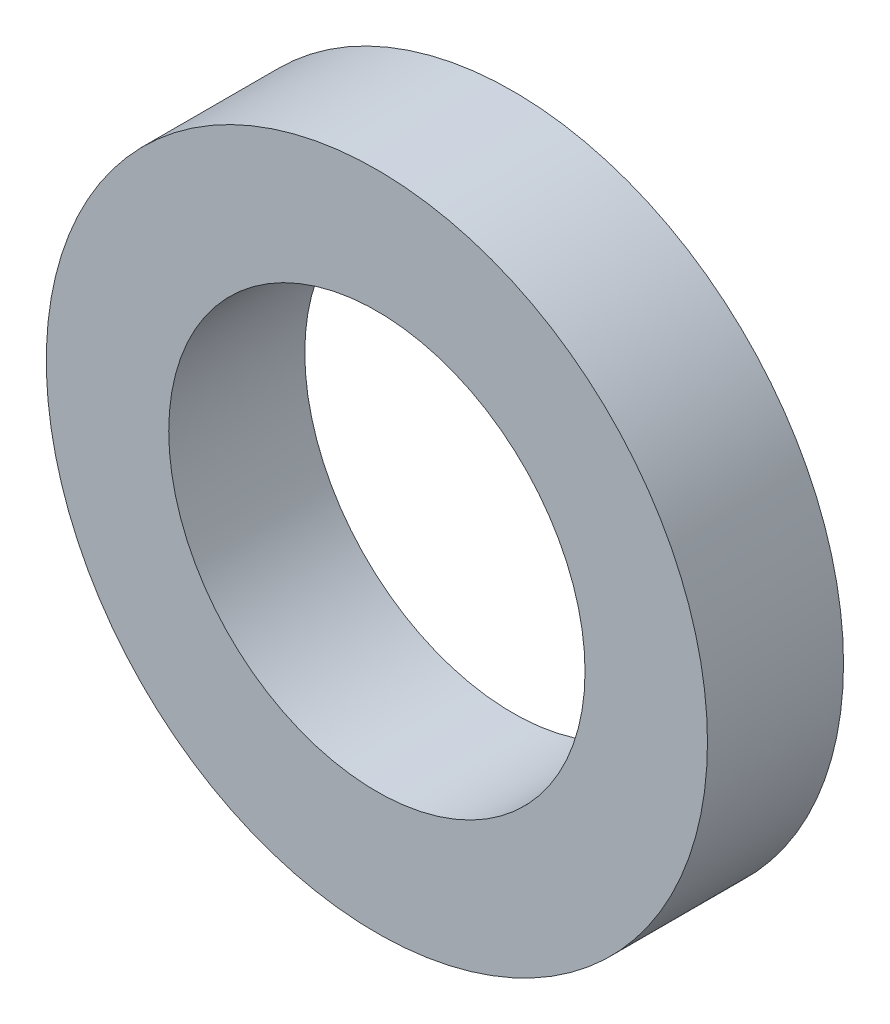
ISO-10303-21;
HEADER;
FILE_DESCRIPTION(('STEP AP214'),'2;1');
FILE_NAME('part.step','',(''),(''),'','','');
FILE_SCHEMA(('AUTOMOTIVE_DESIGN { 1 0 10303 214 1 1 1 1 }'));
ENDSEC;
DATA;
#1=APPLICATION_CONTEXT('core data for automotive mechanical design processes');
#2=APPLICATION_PROTOCOL_DEFINITION('international standard','automotive_design',2000,#1);
#3=PRODUCT_CONTEXT('',#1,'mechanical');
#4=PRODUCT('Part','Part','',(#3));
#5=PRODUCT_RELATED_PRODUCT_CATEGORY('part','',(#4));
#6=PRODUCT_DEFINITION_FORMATION('','',#4);
#7=PRODUCT_DEFINITION_CONTEXT('part definition',#1,'design');
#8=PRODUCT_DEFINITION('design','',#6,#7);
#9=PRODUCT_DEFINITION_SHAPE('','',#8);
#10=(LENGTH_UNIT() NAMED_UNIT(*) SI_UNIT(.MILLI.,.METRE.));
#11=(NAMED_UNIT(*) PLANE_ANGLE_UNIT() SI_UNIT($,.RADIAN.));
#12=(NAMED_UNIT(*) SI_UNIT($,.STERADIAN.) SOLID_ANGLE_UNIT());
#13=UNCERTAINTY_MEASURE_WITH_UNIT(LENGTH_MEASURE(1.E-05),#10,'distance_accuracy_value','');
#14=(GEOMETRIC_REPRESENTATION_CONTEXT(3) GLOBAL_UNCERTAINTY_ASSIGNED_CONTEXT((#13)) GLOBAL_UNIT_ASSIGNED_CONTEXT((#10,
#11,#12)) REPRESENTATION_CONTEXT('',''));
#15=CARTESIAN_POINT('',(0.,0.,0.));
#16=DIRECTION('',(0.,0.,1.));
#17=DIRECTION('',(1.,0.,0.));
#18=AXIS2_PLACEMENT_3D('',#15,#16,#17);
#19=CARTESIAN_POINT('',(0.,0.,5.));
#20=DIRECTION('',(0.,0.,1.));
#21=DIRECTION('',(1.,0.,0.));
#22=AXIS2_PLACEMENT_3D('',#19,#20,#21);
#23=PLANE('',#22);
#24=CARTESIAN_POINT('',(0.,0.,5.));
#25=DIRECTION('',(0.,0.,1.));
#26=DIRECTION('',(1.,0.,0.));
#27=AXIS2_PLACEMENT_3D('',#24,#25,#26);
#28=CIRCLE('',#27,12.15);
#29=CARTESIAN_POINT('',(12.15,0.,5.));
#30=VERTEX_POINT('',#29);
#31=EDGE_CURVE('E10',#30,#30,#28,.T.);
#32=ORIENTED_EDGE('',*,*,#31,.T.);
#33=EDGE_LOOP('',(#32));
#34=FACE_BOUND('',#33,.T.);
#35=CARTESIAN_POINT('',(0.,0.,5.));
#36=DIRECTION('',(0.,0.,1.));
#37=DIRECTION('',(1.,0.,0.));
#38=AXIS2_PLACEMENT_3D('',#35,#36,#37);
#39=CIRCLE('',#38,7.65);
#40=CARTESIAN_POINT('',(7.65,0.,5.));
#41=VERTEX_POINT('',#40);
#42=EDGE_CURVE('E44',#41,#41,#39,.T.);
#43=ORIENTED_EDGE('',*,*,#42,.F.);
#44=EDGE_LOOP('',(#43));
#45=FACE_BOUND('',#44,.T.);
#46=ADVANCED_FACE('F33',(#34,#45),#23,.T.);
#47=CARTESIAN_POINT('',(0.,0.,0.));
#48=DIRECTION('',(0.,0.,1.));
#49=DIRECTION('',(1.,0.,0.));
#50=AXIS2_PLACEMENT_3D('',#47,#48,#49);
#51=PLANE('',#50);
#52=CARTESIAN_POINT('',(0.,0.,0.));
#53=DIRECTION('',(0.,0.,1.));
#54=DIRECTION('',(1.,0.,0.));
#55=AXIS2_PLACEMENT_3D('',#52,#53,#54);
#56=CIRCLE('',#55,12.15);
#57=CARTESIAN_POINT('',(12.15,0.,0.));
#58=VERTEX_POINT('',#57);
#59=EDGE_CURVE('E37',#58,#58,#56,.T.);
#60=ORIENTED_EDGE('',*,*,#59,.F.);
#61=EDGE_LOOP('',(#60));
#62=FACE_BOUND('',#61,.T.);
#63=CARTESIAN_POINT('',(0.,0.,0.));
#64=DIRECTION('',(0.,0.,1.));
#65=DIRECTION('',(1.,0.,0.));
#66=AXIS2_PLACEMENT_3D('',#63,#64,#65);
#67=CIRCLE('',#66,7.65);
#68=CARTESIAN_POINT('',(7.65,0.,0.));
#69=VERTEX_POINT('',#68);
#70=EDGE_CURVE('E46',#69,#69,#67,.T.);
#71=ORIENTED_EDGE('',*,*,#70,.T.);
#72=EDGE_LOOP('',(#71));
#73=FACE_BOUND('',#72,.T.);
#74=ADVANCED_FACE('F56',(#62,#73),#51,.F.);
#75=CARTESIAN_POINT('',(0.,0.,5.));
#76=DIRECTION('',(0.,0.,-1.));
#77=DIRECTION('',(-1.,0.,0.));
#78=AXIS2_PLACEMENT_3D('',#75,#76,#77);
#79=CYLINDRICAL_SURFACE('',#78,12.15);
#80=ORIENTED_EDGE('',*,*,#31,.F.);
#81=EDGE_LOOP('',(#80));
#82=FACE_BOUND('',#81,.T.);
#83=ORIENTED_EDGE('',*,*,#59,.T.);
#84=EDGE_LOOP('',(#83));
#85=FACE_BOUND('',#84,.T.);
#86=ADVANCED_FACE('F35',(#82,#85),#79,.T.);
#87=CARTESIAN_POINT('',(0.,0.,5.));
#88=DIRECTION('',(0.,0.,-1.));
#89=DIRECTION('',(-1.,0.,0.));
#90=AXIS2_PLACEMENT_3D('',#87,#88,#89);
#91=CYLINDRICAL_SURFACE('',#90,7.65);
#92=ORIENTED_EDGE('',*,*,#42,.T.);
#93=EDGE_LOOP('',(#92));
#94=FACE_BOUND('',#93,.T.);
#95=ORIENTED_EDGE('',*,*,#70,.F.);
#96=EDGE_LOOP('',(#95));
#97=FACE_BOUND('',#96,.T.);
#98=ADVANCED_FACE('F52',(#94,#97),#91,.F.);
#99=CLOSED_SHELL('',(#46,#74,#86,#98));
#100=MANIFOLD_SOLID_BREP('B2',#99);
#101=ADVANCED_BREP_SHAPE_REPRESENTATION('',(#18,#100),#14);
#102=SHAPE_DEFINITION_REPRESENTATION(#9,#101);
ENDSEC;
END-ISO-10303-21;
